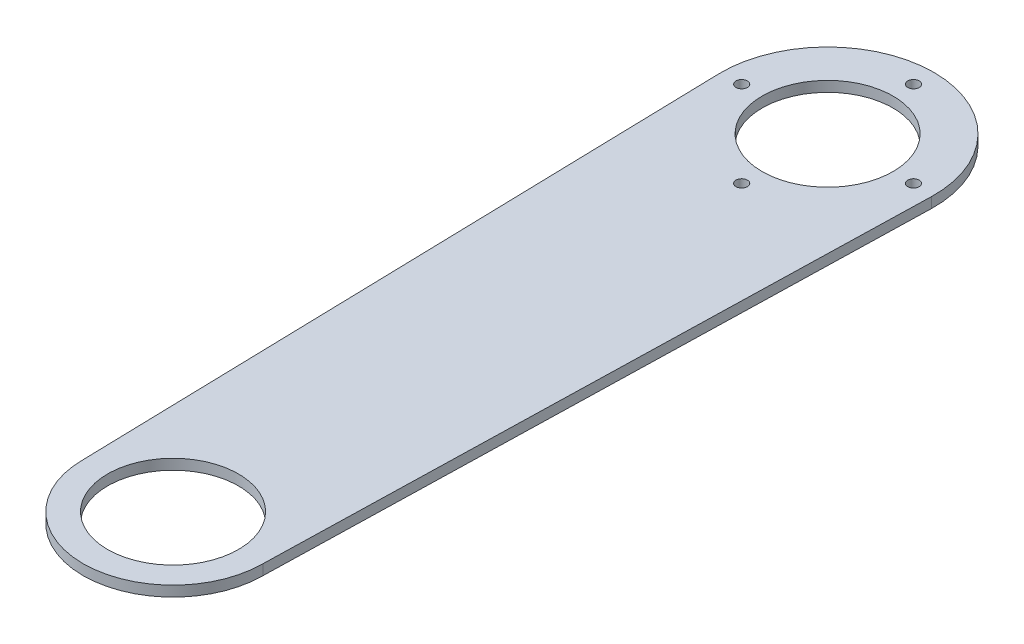
ISO-10303-21;
HEADER;
FILE_DESCRIPTION(('STEP AP214'),'2;1');
FILE_NAME('part.step','',(''),(''),'','','');
FILE_SCHEMA(('AUTOMOTIVE_DESIGN { 1 0 10303 214 1 1 1 1 }'));
ENDSEC;
DATA;
#1=APPLICATION_CONTEXT('core data for automotive mechanical design processes');
#2=APPLICATION_PROTOCOL_DEFINITION('international standard','automotive_design',2000,#1);
#3=PRODUCT_CONTEXT('',#1,'mechanical');
#4=PRODUCT('Part','Part','',(#3));
#5=PRODUCT_RELATED_PRODUCT_CATEGORY('part','',(#4));
#6=PRODUCT_DEFINITION_FORMATION('','',#4);
#7=PRODUCT_DEFINITION_CONTEXT('part definition',#1,'design');
#8=PRODUCT_DEFINITION('design','',#6,#7);
#9=PRODUCT_DEFINITION_SHAPE('','',#8);
#10=(LENGTH_UNIT() NAMED_UNIT(*) SI_UNIT(.MILLI.,.METRE.));
#11=(NAMED_UNIT(*) PLANE_ANGLE_UNIT() SI_UNIT($,.RADIAN.));
#12=(NAMED_UNIT(*) SI_UNIT($,.STERADIAN.) SOLID_ANGLE_UNIT());
#13=UNCERTAINTY_MEASURE_WITH_UNIT(LENGTH_MEASURE(1.E-05),#10,'distance_accuracy_value','');
#14=(GEOMETRIC_REPRESENTATION_CONTEXT(3) GLOBAL_UNCERTAINTY_ASSIGNED_CONTEXT((#13)) GLOBAL_UNIT_ASSIGNED_CONTEXT((#10,
#11,#12)) REPRESENTATION_CONTEXT('',''));
#15=CARTESIAN_POINT('',(0.,0.,0.));
#16=DIRECTION('',(0.,0.,1.));
#17=DIRECTION('',(1.,0.,0.));
#18=AXIS2_PLACEMENT_3D('',#15,#16,#17);
#19=CARTESIAN_POINT('',(29.986280118381,3.175,0.751185720695088));
#20=DIRECTION('',(-0.999686371791874,0.,-0.0250431238786174));
#21=DIRECTION('',(-0.0250431238786174,0.,0.999686371791874));
#22=AXIS2_PLACEMENT_3D('',#19,#20,#21);
#23=PLANE('',#22);
#24=DIRECTION('',(0.0250431238786174,0.,-0.999686371791874));
#25=VECTOR('',#24,1.);
#26=CARTESIAN_POINT('',(29.986280118381,0.,0.751185720695088));
#27=LINE('',#26,#25);
#28=CARTESIAN_POINT('',(27.5,0.,100.));
#29=VERTEX_POINT('',#28);
#30=CARTESIAN_POINT('',(32.4898070832359,0.,-99.186098473945));
#31=VERTEX_POINT('',#30);
#32=EDGE_CURVE('E103',#29,#31,#27,.T.);
#33=ORIENTED_EDGE('',*,*,#32,.T.);
#34=DIRECTION('',(0.,-1.,0.));
#35=VECTOR('',#34,1.);
#36=CARTESIAN_POINT('',(32.4898070832359,3.175,-99.186098473945));
#37=LINE('',#36,#35);
#38=CARTESIAN_POINT('',(32.4898070832359,3.175,-99.186098473945));
#39=VERTEX_POINT('',#38);
#40=EDGE_CURVE('E11',#39,#31,#37,.T.);
#41=ORIENTED_EDGE('',*,*,#40,.F.);
#42=DIRECTION('',(0.0250431238786174,0.,-0.999686371791874));
#43=VECTOR('',#42,1.);
#44=CARTESIAN_POINT('',(29.986280118381,3.175,0.751185720695088));
#45=LINE('',#44,#43);
#46=CARTESIAN_POINT('',(27.5,3.175,100.));
#47=VERTEX_POINT('',#46);
#48=EDGE_CURVE('E88',#47,#39,#45,.T.);
#49=ORIENTED_EDGE('',*,*,#48,.F.);
#50=DIRECTION('',(0.,-1.,0.));
#51=VECTOR('',#50,1.);
#52=CARTESIAN_POINT('',(27.5,3.175,100.));
#53=LINE('',#52,#51);
#54=EDGE_CURVE('E99',#47,#29,#53,.T.);
#55=ORIENTED_EDGE('',*,*,#54,.T.);
#56=EDGE_LOOP('',(#33,#41,#49,#55));
#57=FACE_BOUND('',#56,.T.);
#58=ADVANCED_FACE('F41',(#57),#23,.F.);
#59=CARTESIAN_POINT('',(0.,3.175,-100.));
#60=DIRECTION('',(0.,-1.,0.));
#61=DIRECTION('',(0.,0.,-1.));
#62=AXIS2_PLACEMENT_3D('',#59,#60,#61);
#63=CYLINDRICAL_SURFACE('',#62,32.5);
#64=CARTESIAN_POINT('',(0.,0.,-100.));
#65=DIRECTION('',(0.,1.,0.));
#66=DIRECTION('',(0.,0.,1.));
#67=AXIS2_PLACEMENT_3D('',#64,#65,#66);
#68=CIRCLE('',#67,32.5);
#69=CARTESIAN_POINT('',(-32.4898070832359,0.,-99.186098473945));
#70=VERTEX_POINT('',#69);
#71=EDGE_CURVE('E93',#31,#70,#68,.T.);
#72=ORIENTED_EDGE('',*,*,#71,.T.);
#73=DIRECTION('',(0.,-1.,0.));
#74=VECTOR('',#73,1.);
#75=CARTESIAN_POINT('',(-32.4898070832359,3.175,-99.186098473945));
#76=LINE('',#75,#74);
#77=CARTESIAN_POINT('',(-32.4898070832359,3.175,-99.186098473945));
#78=VERTEX_POINT('',#77);
#79=EDGE_CURVE('E49',#78,#70,#76,.T.);
#80=ORIENTED_EDGE('',*,*,#79,.F.);
#81=CARTESIAN_POINT('',(0.,3.175,-100.));
#82=DIRECTION('',(0.,1.,0.));
#83=DIRECTION('',(0.,0.,1.));
#84=AXIS2_PLACEMENT_3D('',#81,#82,#83);
#85=CIRCLE('',#84,32.5);
#86=EDGE_CURVE('E83',#39,#78,#85,.T.);
#87=ORIENTED_EDGE('',*,*,#86,.F.);
#88=ORIENTED_EDGE('',*,*,#40,.T.);
#89=EDGE_LOOP('',(#72,#80,#87,#88));
#90=FACE_BOUND('',#89,.T.);
#91=ADVANCED_FACE('F92',(#90),#63,.T.);
#92=CARTESIAN_POINT('',(-29.986280118381,3.175,0.751185720695088));
#93=DIRECTION('',(-0.999686371791874,0.,0.0250431238786174));
#94=DIRECTION('',(0.0250431238786174,0.,0.999686371791874));
#95=AXIS2_PLACEMENT_3D('',#92,#93,#94);
#96=PLANE('',#95);
#97=DIRECTION('',(-0.0250431238786174,0.,-0.999686371791874));
#98=VECTOR('',#97,1.);
#99=CARTESIAN_POINT('',(-29.986280118381,0.,0.751185720695088));
#100=LINE('',#99,#98);
#101=CARTESIAN_POINT('',(-27.5,0.,100.));
#102=VERTEX_POINT('',#101);
#103=EDGE_CURVE('E108',#102,#70,#100,.T.);
#104=ORIENTED_EDGE('',*,*,#103,.F.);
#105=DIRECTION('',(0.,-1.,0.));
#106=VECTOR('',#105,1.);
#107=CARTESIAN_POINT('',(-27.5,3.175,100.));
#108=LINE('',#107,#106);
#109=CARTESIAN_POINT('',(-27.5,3.175,100.));
#110=VERTEX_POINT('',#109);
#111=EDGE_CURVE('E73',#110,#102,#108,.T.);
#112=ORIENTED_EDGE('',*,*,#111,.F.);
#113=DIRECTION('',(-0.0250431238786174,0.,-0.999686371791874));
#114=VECTOR('',#113,1.);
#115=CARTESIAN_POINT('',(-29.986280118381,3.175,0.751185720695088));
#116=LINE('',#115,#114);
#117=EDGE_CURVE('E86',#110,#78,#116,.T.);
#118=ORIENTED_EDGE('',*,*,#117,.T.);
#119=ORIENTED_EDGE('',*,*,#79,.T.);
#120=EDGE_LOOP('',(#104,#112,#118,#119));
#121=FACE_BOUND('',#120,.T.);
#122=ADVANCED_FACE('F97',(#121),#96,.T.);
#123=CARTESIAN_POINT('',(0.,3.175,100.));
#124=DIRECTION('',(0.,-1.,0.));
#125=DIRECTION('',(0.,0.,-1.));
#126=AXIS2_PLACEMENT_3D('',#123,#124,#125);
#127=CYLINDRICAL_SURFACE('',#126,27.5);
#128=CARTESIAN_POINT('',(0.,0.,100.));
#129=DIRECTION('',(0.,1.,0.));
#130=DIRECTION('',(0.,0.,1.));
#131=AXIS2_PLACEMENT_3D('',#128,#129,#130);
#132=CIRCLE('',#131,27.5);
#133=EDGE_CURVE('E76',#102,#29,#132,.T.);
#134=ORIENTED_EDGE('',*,*,#133,.T.);
#135=ORIENTED_EDGE('',*,*,#54,.F.);
#136=CARTESIAN_POINT('',(0.,3.175,100.));
#137=DIRECTION('',(0.,1.,0.));
#138=DIRECTION('',(0.,0.,1.));
#139=AXIS2_PLACEMENT_3D('',#136,#137,#138);
#140=CIRCLE('',#139,27.5);
#141=EDGE_CURVE('E57',#110,#47,#140,.T.);
#142=ORIENTED_EDGE('',*,*,#141,.F.);
#143=ORIENTED_EDGE('',*,*,#111,.T.);
#144=EDGE_LOOP('',(#134,#135,#142,#143));
#145=FACE_BOUND('',#144,.T.);
#146=ADVANCED_FACE('F128',(#145),#127,.T.);
#147=CARTESIAN_POINT('',(0.,3.175,0.));
#148=DIRECTION('',(0.,1.,0.));
#149=DIRECTION('',(0.,0.,1.));
#150=AXIS2_PLACEMENT_3D('',#147,#148,#149);
#151=PLANE('',#150);
#152=CARTESIAN_POINT('',(0.,3.175,-73.75));
#153=DIRECTION('',(0.,1.,0.));
#154=DIRECTION('',(0.,0.,1.));
#155=AXIS2_PLACEMENT_3D('',#152,#153,#154);
#156=CIRCLE('',#155,1.75);
#157=CARTESIAN_POINT('',(0.,3.175,-72.));
#158=VERTEX_POINT('',#157);
#159=EDGE_CURVE('E218',#158,#158,#156,.T.);
#160=ORIENTED_EDGE('',*,*,#159,.F.);
#161=EDGE_LOOP('',(#160));
#162=FACE_BOUND('',#161,.T.);
#163=CARTESIAN_POINT('',(26.25,3.175,-100.));
#164=DIRECTION('',(0.,1.,0.));
#165=DIRECTION('',(0.,0.,1.));
#166=AXIS2_PLACEMENT_3D('',#163,#164,#165);
#167=CIRCLE('',#166,1.75);
#168=CARTESIAN_POINT('',(26.25,3.175,-98.25));
#169=VERTEX_POINT('',#168);
#170=EDGE_CURVE('E224',#169,#169,#167,.T.);
#171=ORIENTED_EDGE('',*,*,#170,.F.);
#172=EDGE_LOOP('',(#171));
#173=FACE_BOUND('',#172,.T.);
#174=CARTESIAN_POINT('',(0.,3.175,-126.25));
#175=DIRECTION('',(0.,1.,0.));
#176=DIRECTION('',(0.,0.,1.));
#177=AXIS2_PLACEMENT_3D('',#174,#175,#176);
#178=CIRCLE('',#177,1.75);
#179=CARTESIAN_POINT('',(0.,3.175,-124.5));
#180=VERTEX_POINT('',#179);
#181=EDGE_CURVE('E232',#180,#180,#178,.T.);
#182=ORIENTED_EDGE('',*,*,#181,.F.);
#183=EDGE_LOOP('',(#182));
#184=FACE_BOUND('',#183,.T.);
#185=CARTESIAN_POINT('',(-26.25,3.175,-100.));
#186=DIRECTION('',(0.,1.,0.));
#187=DIRECTION('',(0.,0.,1.));
#188=AXIS2_PLACEMENT_3D('',#185,#186,#187);
#189=CIRCLE('',#188,1.75);
#190=CARTESIAN_POINT('',(-26.25,3.175,-98.25));
#191=VERTEX_POINT('',#190);
#192=EDGE_CURVE('E238',#191,#191,#189,.T.);
#193=ORIENTED_EDGE('',*,*,#192,.F.);
#194=EDGE_LOOP('',(#193));
#195=FACE_BOUND('',#194,.T.);
#196=CARTESIAN_POINT('',(0.,3.175,100.));
#197=DIRECTION('',(0.,1.,0.));
#198=DIRECTION('',(0.,0.,1.));
#199=AXIS2_PLACEMENT_3D('',#196,#197,#198);
#200=CIRCLE('',#199,20.);
#201=CARTESIAN_POINT('',(0.,3.175,120.));
#202=VERTEX_POINT('',#201);
#203=EDGE_CURVE('E243',#202,#202,#200,.T.);
#204=ORIENTED_EDGE('',*,*,#203,.F.);
#205=EDGE_LOOP('',(#204));
#206=FACE_BOUND('',#205,.T.);
#207=CARTESIAN_POINT('',(0.,3.175,-100.));
#208=DIRECTION('',(0.,1.,0.));
#209=DIRECTION('',(0.,0.,1.));
#210=AXIS2_PLACEMENT_3D('',#207,#208,#209);
#211=CIRCLE('',#210,20.);
#212=CARTESIAN_POINT('',(0.,3.175,-80.));
#213=VERTEX_POINT('',#212);
#214=EDGE_CURVE('E221',#213,#213,#211,.T.);
#215=ORIENTED_EDGE('',*,*,#214,.F.);
#216=EDGE_LOOP('',(#215));
#217=FACE_BOUND('',#216,.T.);
#218=ORIENTED_EDGE('',*,*,#48,.T.);
#219=ORIENTED_EDGE('',*,*,#86,.T.);
#220=ORIENTED_EDGE('',*,*,#117,.F.);
#221=ORIENTED_EDGE('',*,*,#141,.T.);
#222=EDGE_LOOP('',(#218,#219,#220,#221));
#223=FACE_BOUND('',#222,.T.);
#224=ADVANCED_FACE('F84',(#162,#173,#184,#195,#206,#217,#223),#151,.T.);
#225=CARTESIAN_POINT('',(0.,0.,0.));
#226=DIRECTION('',(0.,1.,0.));
#227=DIRECTION('',(0.,0.,1.));
#228=AXIS2_PLACEMENT_3D('',#225,#226,#227);
#229=PLANE('',#228);
#230=CARTESIAN_POINT('',(0.,0.,-73.75));
#231=DIRECTION('',(0.,1.,0.));
#232=DIRECTION('',(0.,0.,1.));
#233=AXIS2_PLACEMENT_3D('',#230,#231,#232);
#234=CIRCLE('',#233,1.75);
#235=CARTESIAN_POINT('',(0.,0.,-72.));
#236=VERTEX_POINT('',#235);
#237=EDGE_CURVE('E215',#236,#236,#234,.T.);
#238=ORIENTED_EDGE('',*,*,#237,.T.);
#239=EDGE_LOOP('',(#238));
#240=FACE_BOUND('',#239,.T.);
#241=CARTESIAN_POINT('',(26.25,0.,-100.));
#242=DIRECTION('',(0.,1.,0.));
#243=DIRECTION('',(0.,0.,1.));
#244=AXIS2_PLACEMENT_3D('',#241,#242,#243);
#245=CIRCLE('',#244,1.75);
#246=CARTESIAN_POINT('',(26.25,0.,-98.25));
#247=VERTEX_POINT('',#246);
#248=EDGE_CURVE('E219',#247,#247,#245,.T.);
#249=ORIENTED_EDGE('',*,*,#248,.T.);
#250=EDGE_LOOP('',(#249));
#251=FACE_BOUND('',#250,.T.);
#252=CARTESIAN_POINT('',(0.,0.,-126.25));
#253=DIRECTION('',(0.,1.,0.));
#254=DIRECTION('',(0.,0.,1.));
#255=AXIS2_PLACEMENT_3D('',#252,#253,#254);
#256=CIRCLE('',#255,1.75);
#257=CARTESIAN_POINT('',(0.,0.,-124.5));
#258=VERTEX_POINT('',#257);
#259=EDGE_CURVE('E229',#258,#258,#256,.T.);
#260=ORIENTED_EDGE('',*,*,#259,.T.);
#261=EDGE_LOOP('',(#260));
#262=FACE_BOUND('',#261,.T.);
#263=CARTESIAN_POINT('',(-26.25,0.,-100.));
#264=DIRECTION('',(0.,1.,0.));
#265=DIRECTION('',(0.,0.,1.));
#266=AXIS2_PLACEMENT_3D('',#263,#264,#265);
#267=CIRCLE('',#266,1.75);
#268=CARTESIAN_POINT('',(-26.25,0.,-98.25));
#269=VERTEX_POINT('',#268);
#270=EDGE_CURVE('E235',#269,#269,#267,.T.);
#271=ORIENTED_EDGE('',*,*,#270,.T.);
#272=EDGE_LOOP('',(#271));
#273=FACE_BOUND('',#272,.T.);
#274=CARTESIAN_POINT('',(0.,0.,100.));
#275=DIRECTION('',(0.,1.,0.));
#276=DIRECTION('',(0.,0.,1.));
#277=AXIS2_PLACEMENT_3D('',#274,#275,#276);
#278=CIRCLE('',#277,20.);
#279=CARTESIAN_POINT('',(0.,0.,120.));
#280=VERTEX_POINT('',#279);
#281=EDGE_CURVE('E106',#280,#280,#278,.T.);
#282=ORIENTED_EDGE('',*,*,#281,.T.);
#283=EDGE_LOOP('',(#282));
#284=FACE_BOUND('',#283,.T.);
#285=CARTESIAN_POINT('',(0.,0.,-100.));
#286=DIRECTION('',(0.,1.,0.));
#287=DIRECTION('',(0.,0.,1.));
#288=AXIS2_PLACEMENT_3D('',#285,#286,#287);
#289=CIRCLE('',#288,20.);
#290=CARTESIAN_POINT('',(0.,0.,-80.));
#291=VERTEX_POINT('',#290);
#292=EDGE_CURVE('E246',#291,#291,#289,.T.);
#293=ORIENTED_EDGE('',*,*,#292,.T.);
#294=EDGE_LOOP('',(#293));
#295=FACE_BOUND('',#294,.T.);
#296=ORIENTED_EDGE('',*,*,#32,.F.);
#297=ORIENTED_EDGE('',*,*,#133,.F.);
#298=ORIENTED_EDGE('',*,*,#103,.T.);
#299=ORIENTED_EDGE('',*,*,#71,.F.);
#300=EDGE_LOOP('',(#296,#297,#298,#299));
#301=FACE_BOUND('',#300,.T.);
#302=ADVANCED_FACE('F115',(#240,#251,#262,#273,#284,#295,#301),#229,.F.);
#303=CARTESIAN_POINT('',(0.,0.,-100.));
#304=DIRECTION('',(0.,1.,0.));
#305=DIRECTION('',(0.,0.,1.));
#306=AXIS2_PLACEMENT_3D('',#303,#304,#305);
#307=CYLINDRICAL_SURFACE('',#306,20.);
#308=ORIENTED_EDGE('',*,*,#292,.F.);
#309=EDGE_LOOP('',(#308));
#310=FACE_BOUND('',#309,.T.);
#311=ORIENTED_EDGE('',*,*,#214,.T.);
#312=EDGE_LOOP('',(#311));
#313=FACE_BOUND('',#312,.T.);
#314=ADVANCED_FACE('F117',(#310,#313),#307,.F.);
#315=CARTESIAN_POINT('',(0.,0.,100.));
#316=DIRECTION('',(0.,1.,0.));
#317=DIRECTION('',(0.,0.,1.));
#318=AXIS2_PLACEMENT_3D('',#315,#316,#317);
#319=CYLINDRICAL_SURFACE('',#318,20.);
#320=ORIENTED_EDGE('',*,*,#281,.F.);
#321=EDGE_LOOP('',(#320));
#322=FACE_BOUND('',#321,.T.);
#323=ORIENTED_EDGE('',*,*,#203,.T.);
#324=EDGE_LOOP('',(#323));
#325=FACE_BOUND('',#324,.T.);
#326=ADVANCED_FACE('F125',(#322,#325),#319,.F.);
#327=CARTESIAN_POINT('',(-26.25,0.,-100.));
#328=DIRECTION('',(0.,1.,0.));
#329=DIRECTION('',(0.,0.,1.));
#330=AXIS2_PLACEMENT_3D('',#327,#328,#329);
#331=CYLINDRICAL_SURFACE('',#330,1.75);
#332=ORIENTED_EDGE('',*,*,#270,.F.);
#333=EDGE_LOOP('',(#332));
#334=FACE_BOUND('',#333,.T.);
#335=ORIENTED_EDGE('',*,*,#192,.T.);
#336=EDGE_LOOP('',(#335));
#337=FACE_BOUND('',#336,.T.);
#338=ADVANCED_FACE('F167',(#334,#337),#331,.F.);
#339=CARTESIAN_POINT('',(0.,0.,-126.25));
#340=DIRECTION('',(0.,1.,0.));
#341=DIRECTION('',(0.,0.,1.));
#342=AXIS2_PLACEMENT_3D('',#339,#340,#341);
#343=CYLINDRICAL_SURFACE('',#342,1.75);
#344=ORIENTED_EDGE('',*,*,#259,.F.);
#345=EDGE_LOOP('',(#344));
#346=FACE_BOUND('',#345,.T.);
#347=ORIENTED_EDGE('',*,*,#181,.T.);
#348=EDGE_LOOP('',(#347));
#349=FACE_BOUND('',#348,.T.);
#350=ADVANCED_FACE('F174',(#346,#349),#343,.F.);
#351=CARTESIAN_POINT('',(26.25,0.,-100.));
#352=DIRECTION('',(0.,1.,0.));
#353=DIRECTION('',(0.,0.,1.));
#354=AXIS2_PLACEMENT_3D('',#351,#352,#353);
#355=CYLINDRICAL_SURFACE('',#354,1.75);
#356=ORIENTED_EDGE('',*,*,#248,.F.);
#357=EDGE_LOOP('',(#356));
#358=FACE_BOUND('',#357,.T.);
#359=ORIENTED_EDGE('',*,*,#170,.T.);
#360=EDGE_LOOP('',(#359));
#361=FACE_BOUND('',#360,.T.);
#362=ADVANCED_FACE('F182',(#358,#361),#355,.F.);
#363=CARTESIAN_POINT('',(0.,0.,-73.75));
#364=DIRECTION('',(0.,1.,0.));
#365=DIRECTION('',(0.,0.,1.));
#366=AXIS2_PLACEMENT_3D('',#363,#364,#365);
#367=CYLINDRICAL_SURFACE('',#366,1.75);
#368=ORIENTED_EDGE('',*,*,#237,.F.);
#369=EDGE_LOOP('',(#368));
#370=FACE_BOUND('',#369,.T.);
#371=ORIENTED_EDGE('',*,*,#159,.T.);
#372=EDGE_LOOP('',(#371));
#373=FACE_BOUND('',#372,.T.);
#374=ADVANCED_FACE('F190',(#370,#373),#367,.F.);
#375=CLOSED_SHELL('',(#58,#91,#122,#146,#224,#302,#314,#326,#338,#350,#362,#374));
#376=MANIFOLD_SOLID_BREP('B2',#375);
#377=ADVANCED_BREP_SHAPE_REPRESENTATION('',(#18,#376),#14);
#378=SHAPE_DEFINITION_REPRESENTATION(#9,#377);
ENDSEC;
END-ISO-10303-21;
